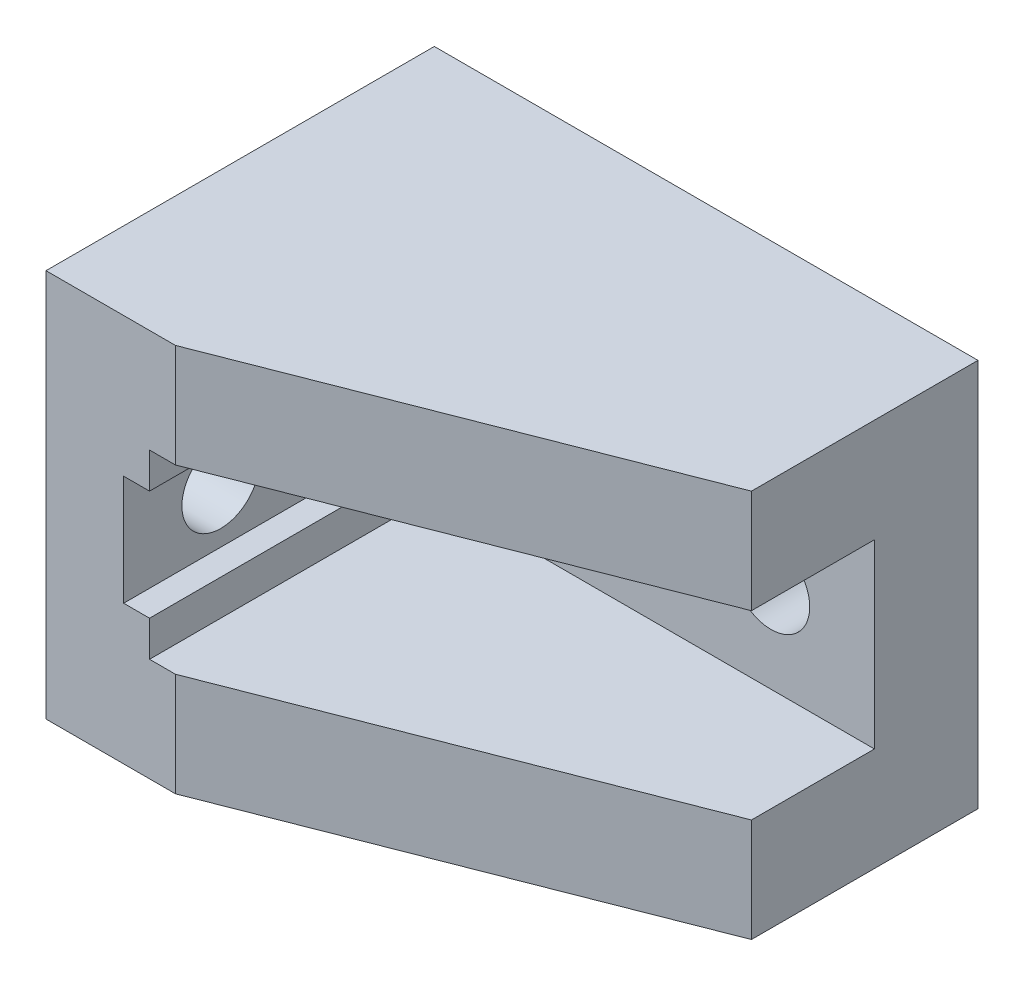
ISO-10303-21;
HEADER;
FILE_DESCRIPTION(('STEP AP214'),'2;1');
FILE_NAME('part.step','',(''),(''),'','','');
FILE_SCHEMA(('AUTOMOTIVE_DESIGN { 1 0 10303 214 1 1 1 1 }'));
ENDSEC;
DATA;
#1=APPLICATION_CONTEXT('core data for automotive mechanical design processes');
#2=APPLICATION_PROTOCOL_DEFINITION('international standard','automotive_design',2000,#1);
#3=PRODUCT_CONTEXT('',#1,'mechanical');
#4=PRODUCT('Part','Part','',(#3));
#5=PRODUCT_RELATED_PRODUCT_CATEGORY('part','',(#4));
#6=PRODUCT_DEFINITION_FORMATION('','',#4);
#7=PRODUCT_DEFINITION_CONTEXT('part definition',#1,'design');
#8=PRODUCT_DEFINITION('design','',#6,#7);
#9=PRODUCT_DEFINITION_SHAPE('','',#8);
#10=(LENGTH_UNIT() NAMED_UNIT(*) SI_UNIT(.MILLI.,.METRE.));
#11=(NAMED_UNIT(*) PLANE_ANGLE_UNIT() SI_UNIT($,.RADIAN.));
#12=(NAMED_UNIT(*) SI_UNIT($,.STERADIAN.) SOLID_ANGLE_UNIT());
#13=UNCERTAINTY_MEASURE_WITH_UNIT(LENGTH_MEASURE(1.E-05),#10,'distance_accuracy_value','');
#14=(GEOMETRIC_REPRESENTATION_CONTEXT(3) GLOBAL_UNCERTAINTY_ASSIGNED_CONTEXT((#13)) GLOBAL_UNIT_ASSIGNED_CONTEXT((#10,
#11,#12)) REPRESENTATION_CONTEXT('',''));
#15=CARTESIAN_POINT('',(0.,0.,0.));
#16=DIRECTION('',(0.,0.,1.));
#17=DIRECTION('',(1.,0.,0.));
#18=AXIS2_PLACEMENT_3D('',#15,#16,#17);
#19=CARTESIAN_POINT('',(8.,30.,0.));
#20=DIRECTION('',(1.,0.,0.));
#21=DIRECTION('',(0.,0.,-1.));
#22=AXIS2_PLACEMENT_3D('',#19,#20,#21);
#23=PLANE('',#22);
#24=DIRECTION('',(0.,0.,-1.));
#25=VECTOR('',#24,1.);
#26=CARTESIAN_POINT('',(8.,10.75,0.));
#27=LINE('',#26,#25);
#28=CARTESIAN_POINT('',(8.,10.75,30.));
#29=VERTEX_POINT('',#28);
#30=CARTESIAN_POINT('',(8.,10.75,8.));
#31=VERTEX_POINT('',#30);
#32=EDGE_CURVE('E193',#29,#31,#27,.T.);
#33=ORIENTED_EDGE('',*,*,#32,.F.);
#34=DIRECTION('',(0.,-1.,0.));
#35=VECTOR('',#34,1.);
#36=CARTESIAN_POINT('',(8.,30.,30.));
#37=LINE('',#36,#35);
#38=CARTESIAN_POINT('',(8.,8.,30.));
#39=VERTEX_POINT('',#38);
#40=EDGE_CURVE('E236',#29,#39,#37,.T.);
#41=ORIENTED_EDGE('',*,*,#40,.T.);
#42=DIRECTION('',(0.,0.,1.));
#43=VECTOR('',#42,1.);
#44=CARTESIAN_POINT('',(8.,8.,0.));
#45=LINE('',#44,#43);
#46=CARTESIAN_POINT('',(8.,8.,8.));
#47=VERTEX_POINT('',#46);
#48=EDGE_CURVE('E213',#47,#39,#45,.T.);
#49=ORIENTED_EDGE('',*,*,#48,.F.);
#50=DIRECTION('',(0.,-1.,0.));
#51=VECTOR('',#50,1.);
#52=CARTESIAN_POINT('',(8.,30.,8.));
#53=LINE('',#52,#51);
#54=EDGE_CURVE('E226',#31,#47,#53,.T.);
#55=ORIENTED_EDGE('',*,*,#54,.F.);
#56=EDGE_LOOP('',(#33,#41,#49,#55));
#57=FACE_BOUND('',#56,.T.);
#58=ADVANCED_FACE('F39',(#57),#23,.T.);
#59=CARTESIAN_POINT('',(0.,30.,30.));
#60=DIRECTION('',(0.,0.,-1.));
#61=DIRECTION('',(-1.,0.,0.));
#62=AXIS2_PLACEMENT_3D('',#59,#60,#61);
#63=PLANE('',#62);
#64=ORIENTED_EDGE('',*,*,#40,.F.);
#65=DIRECTION('',(1.,0.,0.));
#66=VECTOR('',#65,1.);
#67=CARTESIAN_POINT('',(6.,10.75,30.));
#68=LINE('',#67,#66);
#69=CARTESIAN_POINT('',(6.,10.75,30.));
#70=VERTEX_POINT('',#69);
#71=EDGE_CURVE('E170',#70,#29,#68,.T.);
#72=ORIENTED_EDGE('',*,*,#71,.F.);
#73=DIRECTION('',(0.,-1.,0.));
#74=VECTOR('',#73,1.);
#75=CARTESIAN_POINT('',(6.,10.75,30.));
#76=LINE('',#75,#74);
#77=CARTESIAN_POINT('',(6.,19.25,30.));
#78=VERTEX_POINT('',#77);
#79=EDGE_CURVE('E160',#78,#70,#76,.T.);
#80=ORIENTED_EDGE('',*,*,#79,.F.);
#81=DIRECTION('',(-1.,0.,0.));
#82=VECTOR('',#81,1.);
#83=CARTESIAN_POINT('',(6.,19.25,30.));
#84=LINE('',#83,#82);
#85=CARTESIAN_POINT('',(8.,19.25,30.));
#86=VERTEX_POINT('',#85);
#87=EDGE_CURVE('E150',#86,#78,#84,.T.);
#88=ORIENTED_EDGE('',*,*,#87,.F.);
#89=CARTESIAN_POINT('',(8.,22.,30.));
#90=VERTEX_POINT('',#89);
#91=EDGE_CURVE('E233',#90,#86,#37,.T.);
#92=ORIENTED_EDGE('',*,*,#91,.F.);
#93=DIRECTION('',(1.,0.,0.));
#94=VECTOR('',#93,1.);
#95=CARTESIAN_POINT('',(0.,22.,30.));
#96=LINE('',#95,#94);
#97=CARTESIAN_POINT('',(10.,22.,30.));
#98=VERTEX_POINT('',#97);
#99=EDGE_CURVE('E220',#90,#98,#96,.T.);
#100=ORIENTED_EDGE('',*,*,#99,.T.);
#101=DIRECTION('',(0.,-1.,0.));
#102=VECTOR('',#101,1.);
#103=CARTESIAN_POINT('',(10.,30.,30.));
#104=LINE('',#103,#102);
#105=CARTESIAN_POINT('',(10.,30.,30.));
#106=VERTEX_POINT('',#105);
#107=EDGE_CURVE('E284',#106,#98,#104,.T.);
#108=ORIENTED_EDGE('',*,*,#107,.F.);
#109=DIRECTION('',(1.,0.,0.));
#110=VECTOR('',#109,1.);
#111=CARTESIAN_POINT('',(0.,30.,30.));
#112=LINE('',#111,#110);
#113=CARTESIAN_POINT('',(0.,30.,30.));
#114=VERTEX_POINT('',#113);
#115=EDGE_CURVE('E253',#114,#106,#112,.T.);
#116=ORIENTED_EDGE('',*,*,#115,.F.);
#117=DIRECTION('',(0.,-1.,0.));
#118=VECTOR('',#117,1.);
#119=CARTESIAN_POINT('',(0.,30.,30.));
#120=LINE('',#119,#118);
#121=CARTESIAN_POINT('',(0.,0.,30.));
#122=VERTEX_POINT('',#121);
#123=EDGE_CURVE('E287',#114,#122,#120,.T.);
#124=ORIENTED_EDGE('',*,*,#123,.T.);
#125=DIRECTION('',(1.,0.,0.));
#126=VECTOR('',#125,1.);
#127=CARTESIAN_POINT('',(0.,0.,30.));
#128=LINE('',#127,#126);
#129=CARTESIAN_POINT('',(10.,0.,30.));
#130=VERTEX_POINT('',#129);
#131=EDGE_CURVE('E265',#122,#130,#128,.T.);
#132=ORIENTED_EDGE('',*,*,#131,.T.);
#133=CARTESIAN_POINT('',(10.,8.,30.));
#134=VERTEX_POINT('',#133);
#135=EDGE_CURVE('E283',#134,#130,#104,.T.);
#136=ORIENTED_EDGE('',*,*,#135,.F.);
#137=DIRECTION('',(1.,0.,0.));
#138=VECTOR('',#137,1.);
#139=CARTESIAN_POINT('',(0.,8.,30.));
#140=LINE('',#139,#138);
#141=EDGE_CURVE('E216',#39,#134,#140,.T.);
#142=ORIENTED_EDGE('',*,*,#141,.F.);
#143=EDGE_LOOP('',(#64,#72,#80,#88,#92,#100,#108,#116,#124,#132,#136,#142));
#144=FACE_BOUND('',#143,.T.);
#145=ADVANCED_FACE('F169',(#144),#63,.F.);
#146=CARTESIAN_POINT('',(10.,30.,30.));
#147=DIRECTION('',(-0.363850527140476,0.,-0.931457349479619));
#148=DIRECTION('',(-0.931457349479619,0.,0.363850527140476));
#149=AXIS2_PLACEMENT_3D('',#146,#147,#148);
#150=PLANE('',#149);
#151=DIRECTION('',(0.931457349479619,0.,-0.363850527140476));
#152=VECTOR('',#151,1.);
#153=CARTESIAN_POINT('',(10.,8.,30.));
#154=LINE('',#153,#152);
#155=CARTESIAN_POINT('',(42.,8.,17.5));
#156=VERTEX_POINT('',#155);
#157=EDGE_CURVE('E238',#134,#156,#154,.T.);
#158=ORIENTED_EDGE('',*,*,#157,.F.);
#159=ORIENTED_EDGE('',*,*,#135,.T.);
#160=DIRECTION('',(0.931457349479619,0.,-0.363850527140476));
#161=VECTOR('',#160,1.);
#162=CARTESIAN_POINT('',(10.,0.,30.));
#163=LINE('',#162,#161);
#164=CARTESIAN_POINT('',(42.,0.,17.5));
#165=VERTEX_POINT('',#164);
#166=EDGE_CURVE('E268',#130,#165,#163,.T.);
#167=ORIENTED_EDGE('',*,*,#166,.T.);
#168=DIRECTION('',(0.,-1.,0.));
#169=VECTOR('',#168,1.);
#170=CARTESIAN_POINT('',(42.,30.,17.5));
#171=LINE('',#170,#169);
#172=EDGE_CURVE('E279',#156,#165,#171,.T.);
#173=ORIENTED_EDGE('',*,*,#172,.F.);
#174=EDGE_LOOP('',(#158,#159,#167,#173));
#175=FACE_BOUND('',#174,.T.);
#176=ADVANCED_FACE('F330',(#175),#150,.F.);
#177=CARTESIAN_POINT('',(42.,30.,0.));
#178=DIRECTION('',(-1.,0.,0.));
#179=DIRECTION('',(0.,0.,1.));
#180=AXIS2_PLACEMENT_3D('',#177,#178,#179);
#181=PLANE('',#180);
#182=DIRECTION('',(0.,0.,-1.));
#183=VECTOR('',#182,1.);
#184=CARTESIAN_POINT('',(42.,8.,0.));
#185=LINE('',#184,#183);
#186=CARTESIAN_POINT('',(42.,8.,8.));
#187=VERTEX_POINT('',#186);
#188=EDGE_CURVE('E229',#156,#187,#185,.T.);
#189=ORIENTED_EDGE('',*,*,#188,.F.);
#190=ORIENTED_EDGE('',*,*,#172,.T.);
#191=DIRECTION('',(0.,0.,-1.));
#192=VECTOR('',#191,1.);
#193=CARTESIAN_POINT('',(42.,0.,0.));
#194=LINE('',#193,#192);
#195=CARTESIAN_POINT('',(42.,0.,0.));
#196=VERTEX_POINT('',#195);
#197=EDGE_CURVE('E271',#165,#196,#194,.T.);
#198=ORIENTED_EDGE('',*,*,#197,.T.);
#199=DIRECTION('',(0.,-1.,0.));
#200=VECTOR('',#199,1.);
#201=CARTESIAN_POINT('',(42.,30.,0.));
#202=LINE('',#201,#200);
#203=CARTESIAN_POINT('',(42.,30.,0.));
#204=VERTEX_POINT('',#203);
#205=EDGE_CURVE('E276',#204,#196,#202,.T.);
#206=ORIENTED_EDGE('',*,*,#205,.F.);
#207=DIRECTION('',(0.,0.,-1.));
#208=VECTOR('',#207,1.);
#209=CARTESIAN_POINT('',(42.,30.,0.));
#210=LINE('',#209,#208);
#211=CARTESIAN_POINT('',(42.,30.,17.5));
#212=VERTEX_POINT('',#211);
#213=EDGE_CURVE('E258',#212,#204,#210,.T.);
#214=ORIENTED_EDGE('',*,*,#213,.F.);
#215=CARTESIAN_POINT('',(42.,22.,17.5));
#216=VERTEX_POINT('',#215);
#217=EDGE_CURVE('E280',#212,#216,#171,.T.);
#218=ORIENTED_EDGE('',*,*,#217,.T.);
#219=DIRECTION('',(0.,0.,-1.));
#220=VECTOR('',#219,1.);
#221=CARTESIAN_POINT('',(42.,22.,0.));
#222=LINE('',#221,#220);
#223=CARTESIAN_POINT('',(42.,22.,8.));
#224=VERTEX_POINT('',#223);
#225=EDGE_CURVE('E232',#216,#224,#222,.T.);
#226=ORIENTED_EDGE('',*,*,#225,.T.);
#227=DIRECTION('',(0.,-1.,0.));
#228=VECTOR('',#227,1.);
#229=CARTESIAN_POINT('',(42.,30.,8.));
#230=LINE('',#229,#228);
#231=EDGE_CURVE('E225',#224,#187,#230,.T.);
#232=ORIENTED_EDGE('',*,*,#231,.T.);
#233=EDGE_LOOP('',(#189,#190,#198,#206,#214,#218,#226,#232));
#234=FACE_BOUND('',#233,.T.);
#235=ADVANCED_FACE('F344',(#234),#181,.F.);
#236=CARTESIAN_POINT('',(0.,30.,0.));
#237=DIRECTION('',(1.,0.,0.));
#238=DIRECTION('',(0.,0.,-1.));
#239=AXIS2_PLACEMENT_3D('',#236,#237,#238);
#240=PLANE('',#239);
#241=CARTESIAN_POINT('',(0.,15.,22.5));
#242=DIRECTION('',(1.,0.,0.));
#243=DIRECTION('',(0.,0.,-1.));
#244=AXIS2_PLACEMENT_3D('',#241,#242,#243);
#245=CIRCLE('',#244,3.);
#246=CARTESIAN_POINT('',(0.,15.,19.5));
#247=VERTEX_POINT('',#246);
#248=EDGE_CURVE('E210',#247,#247,#245,.T.);
#249=ORIENTED_EDGE('',*,*,#248,.T.);
#250=EDGE_LOOP('',(#249));
#251=FACE_BOUND('',#250,.T.);
#252=CARTESIAN_POINT('',(0.,15.,7.5));
#253=DIRECTION('',(1.,0.,0.));
#254=DIRECTION('',(0.,0.,-1.));
#255=AXIS2_PLACEMENT_3D('',#252,#253,#254);
#256=CIRCLE('',#255,3.);
#257=CARTESIAN_POINT('',(0.,15.,4.5));
#258=VERTEX_POINT('',#257);
#259=EDGE_CURVE('E207',#258,#258,#256,.T.);
#260=ORIENTED_EDGE('',*,*,#259,.T.);
#261=EDGE_LOOP('',(#260));
#262=FACE_BOUND('',#261,.T.);
#263=DIRECTION('',(0.,0.,1.));
#264=VECTOR('',#263,1.);
#265=CARTESIAN_POINT('',(0.,0.,0.));
#266=LINE('',#265,#264);
#267=CARTESIAN_POINT('',(0.,0.,0.));
#268=VERTEX_POINT('',#267);
#269=EDGE_CURVE('E235',#268,#122,#266,.T.);
#270=ORIENTED_EDGE('',*,*,#269,.T.);
#271=ORIENTED_EDGE('',*,*,#123,.F.);
#272=DIRECTION('',(0.,0.,1.));
#273=VECTOR('',#272,1.);
#274=CARTESIAN_POINT('',(0.,30.,0.));
#275=LINE('',#274,#273);
#276=CARTESIAN_POINT('',(0.,30.,0.));
#277=VERTEX_POINT('',#276);
#278=EDGE_CURVE('E250',#277,#114,#275,.T.);
#279=ORIENTED_EDGE('',*,*,#278,.F.);
#280=DIRECTION('',(0.,-1.,0.));
#281=VECTOR('',#280,1.);
#282=CARTESIAN_POINT('',(0.,30.,0.));
#283=LINE('',#282,#281);
#284=EDGE_CURVE('E262',#277,#268,#283,.T.);
#285=ORIENTED_EDGE('',*,*,#284,.T.);
#286=EDGE_LOOP('',(#270,#271,#279,#285));
#287=FACE_BOUND('',#286,.T.);
#288=ADVANCED_FACE('F41',(#251,#262,#287),#240,.F.);
#289=ORIENTED_EDGE('',*,*,#107,.T.);
#290=DIRECTION('',(0.931457349479619,0.,-0.363850527140476));
#291=VECTOR('',#290,1.);
#292=CARTESIAN_POINT('',(10.,22.,30.));
#293=LINE('',#292,#291);
#294=EDGE_CURVE('E245',#98,#216,#293,.T.);
#295=ORIENTED_EDGE('',*,*,#294,.T.);
#296=ORIENTED_EDGE('',*,*,#217,.F.);
#297=DIRECTION('',(0.931457349479619,0.,-0.363850527140476));
#298=VECTOR('',#297,1.);
#299=CARTESIAN_POINT('',(10.,30.,30.));
#300=LINE('',#299,#298);
#301=EDGE_CURVE('E256',#106,#212,#300,.T.);
#302=ORIENTED_EDGE('',*,*,#301,.F.);
#303=EDGE_LOOP('',(#289,#295,#296,#302));
#304=FACE_BOUND('',#303,.T.);
#305=ADVANCED_FACE('F310',(#304),#150,.F.);
#306=CARTESIAN_POINT('',(0.,30.,0.));
#307=DIRECTION('',(0.,0.,1.));
#308=DIRECTION('',(1.,0.,0.));
#309=AXIS2_PLACEMENT_3D('',#306,#307,#308);
#310=PLANE('',#309);
#311=DIRECTION('',(1.,0.,0.));
#312=VECTOR('',#311,1.);
#313=CARTESIAN_POINT('',(6.,10.75,0.));
#314=LINE('',#313,#312);
#315=CARTESIAN_POINT('',(6.,10.75,0.));
#316=VERTEX_POINT('',#315);
#317=CARTESIAN_POINT('',(9.50000000000001,10.75,0.));
#318=VERTEX_POINT('',#317);
#319=EDGE_CURVE('E180',#316,#318,#314,.T.);
#320=ORIENTED_EDGE('',*,*,#319,.T.);
#321=DIRECTION('',(0.,1.,0.));
#322=VECTOR('',#321,1.);
#323=CARTESIAN_POINT('',(9.50000000000001,10.75,0.));
#324=LINE('',#323,#322);
#325=CARTESIAN_POINT('',(9.50000000000001,19.25,0.));
#326=VERTEX_POINT('',#325);
#327=EDGE_CURVE('E172',#318,#326,#324,.T.);
#328=ORIENTED_EDGE('',*,*,#327,.T.);
#329=DIRECTION('',(-1.,0.,0.));
#330=VECTOR('',#329,1.);
#331=CARTESIAN_POINT('',(6.,19.25,0.));
#332=LINE('',#331,#330);
#333=CARTESIAN_POINT('',(6.,19.25,0.));
#334=VERTEX_POINT('',#333);
#335=EDGE_CURVE('E177',#326,#334,#332,.T.);
#336=ORIENTED_EDGE('',*,*,#335,.T.);
#337=DIRECTION('',(0.,-1.,0.));
#338=VECTOR('',#337,1.);
#339=CARTESIAN_POINT('',(6.,10.75,0.));
#340=LINE('',#339,#338);
#341=EDGE_CURVE('E54',#334,#316,#340,.T.);
#342=ORIENTED_EDGE('',*,*,#341,.T.);
#343=EDGE_LOOP('',(#320,#328,#336,#342));
#344=FACE_BOUND('',#343,.T.);
#345=CARTESIAN_POINT('',(16.,15.,0.));
#346=DIRECTION('',(0.,0.,1.));
#347=DIRECTION('',(1.,0.,0.));
#348=AXIS2_PLACEMENT_3D('',#345,#346,#347);
#349=CIRCLE('',#348,3.);
#350=CARTESIAN_POINT('',(19.,15.,0.));
#351=VERTEX_POINT('',#350);
#352=EDGE_CURVE('E204',#351,#351,#349,.T.);
#353=ORIENTED_EDGE('',*,*,#352,.T.);
#354=EDGE_LOOP('',(#353));
#355=FACE_BOUND('',#354,.T.);
#356=CARTESIAN_POINT('',(34.,15.,0.));
#357=DIRECTION('',(0.,0.,1.));
#358=DIRECTION('',(1.,0.,0.));
#359=AXIS2_PLACEMENT_3D('',#356,#357,#358);
#360=CIRCLE('',#359,3.);
#361=CARTESIAN_POINT('',(37.,15.,0.));
#362=VERTEX_POINT('',#361);
#363=EDGE_CURVE('E199',#362,#362,#360,.T.);
#364=ORIENTED_EDGE('',*,*,#363,.T.);
#365=EDGE_LOOP('',(#364));
#366=FACE_BOUND('',#365,.T.);
#367=DIRECTION('',(-1.,0.,0.));
#368=VECTOR('',#367,1.);
#369=CARTESIAN_POINT('',(0.,0.,0.));
#370=LINE('',#369,#368);
#371=EDGE_CURVE('E254',#196,#268,#370,.T.);
#372=ORIENTED_EDGE('',*,*,#371,.T.);
#373=ORIENTED_EDGE('',*,*,#284,.F.);
#374=DIRECTION('',(-1.,0.,0.));
#375=VECTOR('',#374,1.);
#376=CARTESIAN_POINT('',(0.,30.,0.));
#377=LINE('',#376,#375);
#378=EDGE_CURVE('E260',#204,#277,#377,.T.);
#379=ORIENTED_EDGE('',*,*,#378,.F.);
#380=ORIENTED_EDGE('',*,*,#205,.T.);
#381=EDGE_LOOP('',(#372,#373,#379,#380));
#382=FACE_BOUND('',#381,.T.);
#383=ADVANCED_FACE('F369',(#344,#355,#366,#382),#310,.F.);
#384=CARTESIAN_POINT('',(0.,30.,0.));
#385=DIRECTION('',(0.,1.,0.));
#386=DIRECTION('',(0.,0.,1.));
#387=AXIS2_PLACEMENT_3D('',#384,#385,#386);
#388=PLANE('',#387);
#389=ORIENTED_EDGE('',*,*,#278,.T.);
#390=ORIENTED_EDGE('',*,*,#115,.T.);
#391=ORIENTED_EDGE('',*,*,#301,.T.);
#392=ORIENTED_EDGE('',*,*,#213,.T.);
#393=ORIENTED_EDGE('',*,*,#378,.T.);
#394=EDGE_LOOP('',(#389,#390,#391,#392,#393));
#395=FACE_BOUND('',#394,.T.);
#396=ADVANCED_FACE('F314',(#395),#388,.T.);
#397=CARTESIAN_POINT('',(0.,0.,0.));
#398=DIRECTION('',(0.,1.,0.));
#399=DIRECTION('',(0.,0.,1.));
#400=AXIS2_PLACEMENT_3D('',#397,#398,#399);
#401=PLANE('',#400);
#402=ORIENTED_EDGE('',*,*,#269,.F.);
#403=ORIENTED_EDGE('',*,*,#371,.F.);
#404=ORIENTED_EDGE('',*,*,#197,.F.);
#405=ORIENTED_EDGE('',*,*,#166,.F.);
#406=ORIENTED_EDGE('',*,*,#131,.F.);
#407=EDGE_LOOP('',(#402,#403,#404,#405,#406));
#408=FACE_BOUND('',#407,.T.);
#409=ADVANCED_FACE('F325',(#408),#401,.F.);
#410=DIRECTION('',(0.,0.,1.));
#411=VECTOR('',#410,1.);
#412=CARTESIAN_POINT('',(8.,19.25,0.));
#413=LINE('',#412,#411);
#414=CARTESIAN_POINT('',(8.,19.25,8.));
#415=VERTEX_POINT('',#414);
#416=EDGE_CURVE('E155',#415,#86,#413,.T.);
#417=ORIENTED_EDGE('',*,*,#416,.F.);
#418=CARTESIAN_POINT('',(8.,22.,8.));
#419=VERTEX_POINT('',#418);
#420=EDGE_CURVE('E222',#419,#415,#53,.T.);
#421=ORIENTED_EDGE('',*,*,#420,.F.);
#422=DIRECTION('',(0.,0.,1.));
#423=VECTOR('',#422,1.);
#424=CARTESIAN_POINT('',(8.,22.,0.));
#425=LINE('',#424,#423);
#426=EDGE_CURVE('E217',#419,#90,#425,.T.);
#427=ORIENTED_EDGE('',*,*,#426,.T.);
#428=ORIENTED_EDGE('',*,*,#91,.T.);
#429=EDGE_LOOP('',(#417,#421,#427,#428));
#430=FACE_BOUND('',#429,.T.);
#431=ADVANCED_FACE('F304',(#430),#23,.T.);
#432=CARTESIAN_POINT('',(0.,30.,8.));
#433=DIRECTION('',(0.,0.,1.));
#434=DIRECTION('',(1.,0.,0.));
#435=AXIS2_PLACEMENT_3D('',#432,#433,#434);
#436=PLANE('',#435);
#437=DIRECTION('',(1.,0.,0.));
#438=VECTOR('',#437,1.);
#439=CARTESIAN_POINT('',(0.,10.75,8.));
#440=LINE('',#439,#438);
#441=CARTESIAN_POINT('',(9.50000000000001,10.75,8.));
#442=VERTEX_POINT('',#441);
#443=EDGE_CURVE('E12',#31,#442,#440,.T.);
#444=ORIENTED_EDGE('',*,*,#443,.F.);
#445=ORIENTED_EDGE('',*,*,#54,.T.);
#446=DIRECTION('',(-1.,0.,0.));
#447=VECTOR('',#446,1.);
#448=CARTESIAN_POINT('',(0.,8.,8.));
#449=LINE('',#448,#447);
#450=EDGE_CURVE('E221',#187,#47,#449,.T.);
#451=ORIENTED_EDGE('',*,*,#450,.F.);
#452=ORIENTED_EDGE('',*,*,#231,.F.);
#453=DIRECTION('',(-1.,0.,0.));
#454=VECTOR('',#453,1.);
#455=CARTESIAN_POINT('',(0.,22.,8.));
#456=LINE('',#455,#454);
#457=EDGE_CURVE('E230',#224,#419,#456,.T.);
#458=ORIENTED_EDGE('',*,*,#457,.T.);
#459=ORIENTED_EDGE('',*,*,#420,.T.);
#460=DIRECTION('',(-1.,0.,0.));
#461=VECTOR('',#460,1.);
#462=CARTESIAN_POINT('',(0.,19.25,8.));
#463=LINE('',#462,#461);
#464=CARTESIAN_POINT('',(9.50000000000001,19.25,8.));
#465=VERTEX_POINT('',#464);
#466=EDGE_CURVE('E290',#465,#415,#463,.T.);
#467=ORIENTED_EDGE('',*,*,#466,.F.);
#468=DIRECTION('',(0.,1.,0.));
#469=VECTOR('',#468,1.);
#470=CARTESIAN_POINT('',(9.50000000000001,30.,8.));
#471=LINE('',#470,#469);
#472=EDGE_CURVE('E47',#442,#465,#471,.T.);
#473=ORIENTED_EDGE('',*,*,#472,.F.);
#474=EDGE_LOOP('',(#444,#445,#451,#452,#458,#459,#467,#473));
#475=FACE_BOUND('',#474,.T.);
#476=CARTESIAN_POINT('',(16.,15.,8.));
#477=DIRECTION('',(0.,0.,1.));
#478=DIRECTION('',(1.,0.,0.));
#479=AXIS2_PLACEMENT_3D('',#476,#477,#478);
#480=CIRCLE('',#479,3.);
#481=CARTESIAN_POINT('',(19.,15.,8.));
#482=VERTEX_POINT('',#481);
#483=EDGE_CURVE('E196',#482,#482,#480,.T.);
#484=ORIENTED_EDGE('',*,*,#483,.F.);
#485=EDGE_LOOP('',(#484));
#486=FACE_BOUND('',#485,.T.);
#487=CARTESIAN_POINT('',(34.,15.,8.));
#488=DIRECTION('',(0.,0.,1.));
#489=DIRECTION('',(1.,0.,0.));
#490=AXIS2_PLACEMENT_3D('',#487,#488,#489);
#491=CIRCLE('',#490,3.);
#492=CARTESIAN_POINT('',(37.,15.,8.));
#493=VERTEX_POINT('',#492);
#494=EDGE_CURVE('E195',#493,#493,#491,.T.);
#495=ORIENTED_EDGE('',*,*,#494,.F.);
#496=EDGE_LOOP('',(#495));
#497=FACE_BOUND('',#496,.T.);
#498=ADVANCED_FACE('F300',(#475,#486,#497),#436,.T.);
#499=CARTESIAN_POINT('',(0.,22.,0.));
#500=DIRECTION('',(0.,1.,0.));
#501=DIRECTION('',(0.,0.,1.));
#502=AXIS2_PLACEMENT_3D('',#499,#500,#501);
#503=PLANE('',#502);
#504=ORIENTED_EDGE('',*,*,#426,.F.);
#505=ORIENTED_EDGE('',*,*,#457,.F.);
#506=ORIENTED_EDGE('',*,*,#225,.F.);
#507=ORIENTED_EDGE('',*,*,#294,.F.);
#508=ORIENTED_EDGE('',*,*,#99,.F.);
#509=EDGE_LOOP('',(#504,#505,#506,#507,#508));
#510=FACE_BOUND('',#509,.T.);
#511=ADVANCED_FACE('F345',(#510),#503,.F.);
#512=CARTESIAN_POINT('',(0.,8.,0.));
#513=DIRECTION('',(0.,1.,0.));
#514=DIRECTION('',(0.,0.,1.));
#515=AXIS2_PLACEMENT_3D('',#512,#513,#514);
#516=PLANE('',#515);
#517=ORIENTED_EDGE('',*,*,#48,.T.);
#518=ORIENTED_EDGE('',*,*,#141,.T.);
#519=ORIENTED_EDGE('',*,*,#157,.T.);
#520=ORIENTED_EDGE('',*,*,#188,.T.);
#521=ORIENTED_EDGE('',*,*,#450,.T.);
#522=EDGE_LOOP('',(#517,#518,#519,#520,#521));
#523=FACE_BOUND('',#522,.T.);
#524=ADVANCED_FACE('F333',(#523),#516,.T.);
#525=CARTESIAN_POINT('',(-22.,15.,7.5));
#526=DIRECTION('',(1.,0.,0.));
#527=DIRECTION('',(0.,0.,-1.));
#528=AXIS2_PLACEMENT_3D('',#525,#526,#527);
#529=CYLINDRICAL_SURFACE('',#528,3.);
#530=CARTESIAN_POINT('',(6.00000000000001,15.,7.5));
#531=DIRECTION('',(-1.,0.,0.));
#532=DIRECTION('',(0.,0.,1.));
#533=AXIS2_PLACEMENT_3D('',#530,#531,#532);
#534=CIRCLE('',#533,3.);
#535=CARTESIAN_POINT('',(6.00000000000001,15.,10.5));
#536=VERTEX_POINT('',#535);
#537=EDGE_CURVE('E189',#536,#536,#534,.F.);
#538=ORIENTED_EDGE('',*,*,#537,.T.);
#539=EDGE_LOOP('',(#538));
#540=FACE_BOUND('',#539,.T.);
#541=ORIENTED_EDGE('',*,*,#259,.F.);
#542=EDGE_LOOP('',(#541));
#543=FACE_BOUND('',#542,.T.);
#544=ADVANCED_FACE('F352',(#540,#543),#529,.F.);
#545=CARTESIAN_POINT('',(-22.,15.,22.5));
#546=DIRECTION('',(1.,0.,0.));
#547=DIRECTION('',(0.,0.,-1.));
#548=AXIS2_PLACEMENT_3D('',#545,#546,#547);
#549=CYLINDRICAL_SURFACE('',#548,3.);
#550=CARTESIAN_POINT('',(6.,15.,22.5));
#551=DIRECTION('',(-1.,0.,0.));
#552=DIRECTION('',(0.,0.,1.));
#553=AXIS2_PLACEMENT_3D('',#550,#551,#552);
#554=CIRCLE('',#553,3.);
#555=CARTESIAN_POINT('',(6.,15.,25.5));
#556=VERTEX_POINT('',#555);
#557=EDGE_CURVE('E186',#556,#556,#554,.F.);
#558=ORIENTED_EDGE('',*,*,#557,.T.);
#559=EDGE_LOOP('',(#558));
#560=FACE_BOUND('',#559,.T.);
#561=ORIENTED_EDGE('',*,*,#248,.F.);
#562=EDGE_LOOP('',(#561));
#563=FACE_BOUND('',#562,.T.);
#564=ADVANCED_FACE('F410',(#560,#563),#549,.F.);
#565=CARTESIAN_POINT('',(34.,15.,-2.));
#566=DIRECTION('',(0.,0.,1.));
#567=DIRECTION('',(1.,0.,0.));
#568=AXIS2_PLACEMENT_3D('',#565,#566,#567);
#569=CYLINDRICAL_SURFACE('',#568,3.);
#570=ORIENTED_EDGE('',*,*,#494,.T.);
#571=EDGE_LOOP('',(#570));
#572=FACE_BOUND('',#571,.T.);
#573=ORIENTED_EDGE('',*,*,#363,.F.);
#574=EDGE_LOOP('',(#573));
#575=FACE_BOUND('',#574,.T.);
#576=ADVANCED_FACE('F404',(#572,#575),#569,.F.);
#577=CARTESIAN_POINT('',(16.,15.,-2.));
#578=DIRECTION('',(0.,0.,1.));
#579=DIRECTION('',(1.,0.,0.));
#580=AXIS2_PLACEMENT_3D('',#577,#578,#579);
#581=CYLINDRICAL_SURFACE('',#580,3.);
#582=ORIENTED_EDGE('',*,*,#483,.T.);
#583=EDGE_LOOP('',(#582));
#584=FACE_BOUND('',#583,.T.);
#585=ORIENTED_EDGE('',*,*,#352,.F.);
#586=EDGE_LOOP('',(#585));
#587=FACE_BOUND('',#586,.T.);
#588=ADVANCED_FACE('F409',(#584,#587),#581,.F.);
#589=CARTESIAN_POINT('',(6.,10.75,0.));
#590=DIRECTION('',(-1.,0.,0.));
#591=DIRECTION('',(0.,0.,1.));
#592=AXIS2_PLACEMENT_3D('',#589,#590,#591);
#593=PLANE('',#592);
#594=ORIENTED_EDGE('',*,*,#557,.F.);
#595=EDGE_LOOP('',(#594));
#596=FACE_BOUND('',#595,.T.);
#597=DIRECTION('',(0.,0.,1.));
#598=VECTOR('',#597,1.);
#599=CARTESIAN_POINT('',(6.,10.75,0.));
#600=LINE('',#599,#598);
#601=EDGE_CURVE('E166',#316,#70,#600,.T.);
#602=ORIENTED_EDGE('',*,*,#601,.F.);
#603=ORIENTED_EDGE('',*,*,#341,.F.);
#604=DIRECTION('',(0.,0.,1.));
#605=VECTOR('',#604,1.);
#606=CARTESIAN_POINT('',(6.,19.25,0.));
#607=LINE('',#606,#605);
#608=EDGE_CURVE('E152',#334,#78,#607,.T.);
#609=ORIENTED_EDGE('',*,*,#608,.T.);
#610=ORIENTED_EDGE('',*,*,#79,.T.);
#611=EDGE_LOOP('',(#602,#603,#609,#610));
#612=FACE_BOUND('',#611,.T.);
#613=ORIENTED_EDGE('',*,*,#537,.F.);
#614=EDGE_LOOP('',(#613));
#615=FACE_BOUND('',#614,.T.);
#616=ADVANCED_FACE('F163',(#596,#612,#615),#593,.F.);
#617=CARTESIAN_POINT('',(9.50000000000001,10.75,0.));
#618=DIRECTION('',(1.,0.,0.));
#619=DIRECTION('',(0.,0.,-1.));
#620=AXIS2_PLACEMENT_3D('',#617,#618,#619);
#621=PLANE('',#620);
#622=ORIENTED_EDGE('',*,*,#472,.T.);
#623=DIRECTION('',(0.,0.,1.));
#624=VECTOR('',#623,1.);
#625=CARTESIAN_POINT('',(9.50000000000001,19.25,0.));
#626=LINE('',#625,#624);
#627=EDGE_CURVE('E62',#326,#465,#626,.T.);
#628=ORIENTED_EDGE('',*,*,#627,.F.);
#629=ORIENTED_EDGE('',*,*,#327,.F.);
#630=DIRECTION('',(0.,0.,1.));
#631=VECTOR('',#630,1.);
#632=CARTESIAN_POINT('',(9.50000000000001,10.75,0.));
#633=LINE('',#632,#631);
#634=EDGE_CURVE('E183',#318,#442,#633,.T.);
#635=ORIENTED_EDGE('',*,*,#634,.T.);
#636=EDGE_LOOP('',(#622,#628,#629,#635));
#637=FACE_BOUND('',#636,.T.);
#638=ADVANCED_FACE('F296',(#637),#621,.F.);
#639=CARTESIAN_POINT('',(6.,10.75,0.));
#640=DIRECTION('',(0.,-1.,0.));
#641=DIRECTION('',(0.,0.,-1.));
#642=AXIS2_PLACEMENT_3D('',#639,#640,#641);
#643=PLANE('',#642);
#644=ORIENTED_EDGE('',*,*,#32,.T.);
#645=ORIENTED_EDGE('',*,*,#443,.T.);
#646=ORIENTED_EDGE('',*,*,#634,.F.);
#647=ORIENTED_EDGE('',*,*,#319,.F.);
#648=ORIENTED_EDGE('',*,*,#601,.T.);
#649=ORIENTED_EDGE('',*,*,#71,.T.);
#650=EDGE_LOOP('',(#644,#645,#646,#647,#648,#649));
#651=FACE_BOUND('',#650,.T.);
#652=ADVANCED_FACE('F341',(#651),#643,.F.);
#653=CARTESIAN_POINT('',(6.,19.25,0.));
#654=DIRECTION('',(0.,1.,0.));
#655=DIRECTION('',(0.,0.,1.));
#656=AXIS2_PLACEMENT_3D('',#653,#654,#655);
#657=PLANE('',#656);
#658=ORIENTED_EDGE('',*,*,#416,.T.);
#659=ORIENTED_EDGE('',*,*,#87,.T.);
#660=ORIENTED_EDGE('',*,*,#608,.F.);
#661=ORIENTED_EDGE('',*,*,#335,.F.);
#662=ORIENTED_EDGE('',*,*,#627,.T.);
#663=ORIENTED_EDGE('',*,*,#466,.T.);
#664=EDGE_LOOP('',(#658,#659,#660,#661,#662,#663));
#665=FACE_BOUND('',#664,.T.);
#666=ADVANCED_FACE('F151',(#665),#657,.F.);
#667=CLOSED_SHELL('',(#58,#145,#176,#235,#288,#305,#383,#396,#409,#431,#498,#511,#524,#544,#564,
#576,#588,#616,#638,#652,#666));
#668=MANIFOLD_SOLID_BREP('B2',#667);
#669=ADVANCED_BREP_SHAPE_REPRESENTATION('',(#18,#668),#14);
#670=SHAPE_DEFINITION_REPRESENTATION(#9,#669);
ENDSEC;
END-ISO-10303-21;
